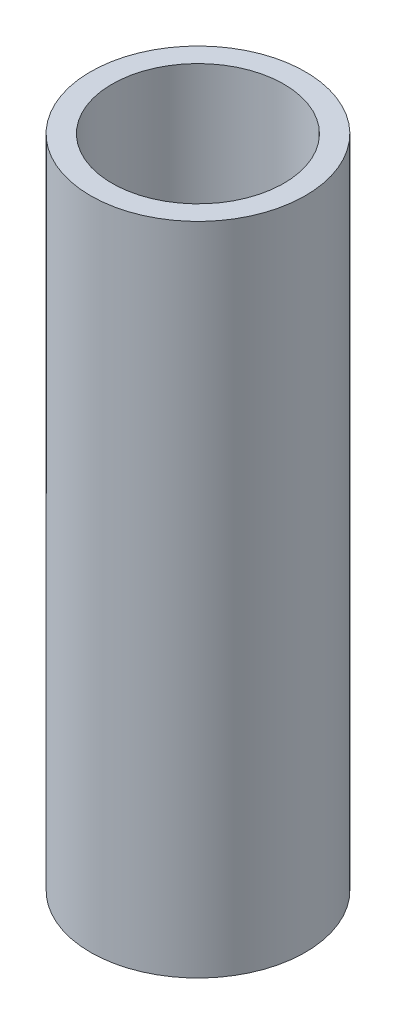
ISO-10303-21;
HEADER;
FILE_DESCRIPTION(('STEP AP214'),'2;1');
FILE_NAME('part.step','',(''),(''),'','','');
FILE_SCHEMA(('AUTOMOTIVE_DESIGN { 1 0 10303 214 1 1 1 1 }'));
ENDSEC;
DATA;
#1=APPLICATION_CONTEXT('core data for automotive mechanical design processes');
#2=APPLICATION_PROTOCOL_DEFINITION('international standard','automotive_design',2000,#1);
#3=PRODUCT_CONTEXT('',#1,'mechanical');
#4=PRODUCT('Part','Part','',(#3));
#5=PRODUCT_RELATED_PRODUCT_CATEGORY('part','',(#4));
#6=PRODUCT_DEFINITION_FORMATION('','',#4);
#7=PRODUCT_DEFINITION_CONTEXT('part definition',#1,'design');
#8=PRODUCT_DEFINITION('design','',#6,#7);
#9=PRODUCT_DEFINITION_SHAPE('','',#8);
#10=(LENGTH_UNIT() NAMED_UNIT(*) SI_UNIT(.MILLI.,.METRE.));
#11=(NAMED_UNIT(*) PLANE_ANGLE_UNIT() SI_UNIT($,.RADIAN.));
#12=(NAMED_UNIT(*) SI_UNIT($,.STERADIAN.) SOLID_ANGLE_UNIT());
#13=UNCERTAINTY_MEASURE_WITH_UNIT(LENGTH_MEASURE(1.E-05),#10,'distance_accuracy_value','');
#14=(GEOMETRIC_REPRESENTATION_CONTEXT(3) GLOBAL_UNCERTAINTY_ASSIGNED_CONTEXT((#13)) GLOBAL_UNIT_ASSIGNED_CONTEXT((#10,
#11,#12)) REPRESENTATION_CONTEXT('',''));
#15=CARTESIAN_POINT('',(0.,0.,0.));
#16=DIRECTION('',(0.,0.,1.));
#17=DIRECTION('',(1.,0.,0.));
#18=AXIS2_PLACEMENT_3D('',#15,#16,#17);
#19=CARTESIAN_POINT('',(0.,3.,0.));
#20=DIRECTION('',(0.,1.,0.));
#21=DIRECTION('',(0.,0.,1.));
#22=AXIS2_PLACEMENT_3D('',#19,#20,#21);
#23=PLANE('',#22);
#24=CARTESIAN_POINT('',(0.,3.,0.));
#25=DIRECTION('',(0.,1.,0.));
#26=DIRECTION('',(0.,0.,1.));
#27=AXIS2_PLACEMENT_3D('',#24,#25,#26);
#28=CIRCLE('',#27,2.65);
#29=CARTESIAN_POINT('',(0.,3.,2.65));
#30=VERTEX_POINT('',#29);
#31=EDGE_CURVE('E50',#30,#30,#28,.T.);
#32=ORIENTED_EDGE('',*,*,#31,.F.);
#33=EDGE_LOOP('',(#32));
#34=FACE_BOUND('',#33,.T.);
#35=CARTESIAN_POINT('',(0.,3.,0.));
#36=DIRECTION('',(0.,1.,0.));
#37=DIRECTION('',(0.,0.,1.));
#38=AXIS2_PLACEMENT_3D('',#35,#36,#37);
#39=CIRCLE('',#38,8.);
#40=CARTESIAN_POINT('',(0.,3.,-8.));
#41=VERTEX_POINT('',#40);
#42=EDGE_CURVE('E10',#41,#41,#39,.F.);
#43=ORIENTED_EDGE('',*,*,#42,.F.);
#44=EDGE_LOOP('',(#43));
#45=FACE_BOUND('',#44,.T.);
#46=ADVANCED_FACE('F37',(#34,#45),#23,.T.);
#47=CARTESIAN_POINT('',(0.,0.,0.));
#48=DIRECTION('',(0.,1.,0.));
#49=DIRECTION('',(0.,0.,1.));
#50=AXIS2_PLACEMENT_3D('',#47,#48,#49);
#51=PLANE('',#50);
#52=CARTESIAN_POINT('',(0.,0.,0.));
#53=DIRECTION('',(0.,1.,0.));
#54=DIRECTION('',(0.,0.,1.));
#55=AXIS2_PLACEMENT_3D('',#52,#53,#54);
#56=CIRCLE('',#55,10.);
#57=CARTESIAN_POINT('',(0.,0.,10.));
#58=VERTEX_POINT('',#57);
#59=EDGE_CURVE('E45',#58,#58,#56,.T.);
#60=ORIENTED_EDGE('',*,*,#59,.F.);
#61=EDGE_LOOP('',(#60));
#62=FACE_BOUND('',#61,.T.);
#63=CARTESIAN_POINT('',(0.,0.,0.));
#64=DIRECTION('',(0.,1.,0.));
#65=DIRECTION('',(0.,0.,1.));
#66=AXIS2_PLACEMENT_3D('',#63,#64,#65);
#67=CIRCLE('',#66,2.65);
#68=CARTESIAN_POINT('',(0.,0.,2.65));
#69=VERTEX_POINT('',#68);
#70=EDGE_CURVE('E55',#69,#69,#67,.T.);
#71=ORIENTED_EDGE('',*,*,#70,.T.);
#72=EDGE_LOOP('',(#71));
#73=FACE_BOUND('',#72,.T.);
#74=ADVANCED_FACE('F85',(#62,#73),#51,.F.);
#75=CARTESIAN_POINT('',(0.,3.,0.));
#76=DIRECTION('',(0.,-1.,0.));
#77=DIRECTION('',(0.,0.,-1.));
#78=AXIS2_PLACEMENT_3D('',#75,#76,#77);
#79=CYLINDRICAL_SURFACE('',#78,10.);
#80=ORIENTED_EDGE('',*,*,#59,.T.);
#81=EDGE_LOOP('',(#80));
#82=FACE_BOUND('',#81,.T.);
#83=CARTESIAN_POINT('',(0.,61.,0.));
#84=DIRECTION('',(0.,1.,0.));
#85=DIRECTION('',(0.,0.,1.));
#86=AXIS2_PLACEMENT_3D('',#83,#84,#85);
#87=CIRCLE('',#86,10.);
#88=CARTESIAN_POINT('',(0.,61.,10.));
#89=VERTEX_POINT('',#88);
#90=EDGE_CURVE('E60',#89,#89,#87,.T.);
#91=ORIENTED_EDGE('',*,*,#90,.F.);
#92=EDGE_LOOP('',(#91));
#93=FACE_BOUND('',#92,.T.);
#94=ADVANCED_FACE('F39',(#82,#93),#79,.T.);
#95=CARTESIAN_POINT('',(0.,3.,0.));
#96=DIRECTION('',(0.,-1.,0.));
#97=DIRECTION('',(0.,0.,-1.));
#98=AXIS2_PLACEMENT_3D('',#95,#96,#97);
#99=CYLINDRICAL_SURFACE('',#98,2.65);
#100=ORIENTED_EDGE('',*,*,#31,.T.);
#101=EDGE_LOOP('',(#100));
#102=FACE_BOUND('',#101,.T.);
#103=ORIENTED_EDGE('',*,*,#70,.F.);
#104=EDGE_LOOP('',(#103));
#105=FACE_BOUND('',#104,.T.);
#106=ADVANCED_FACE('F74',(#102,#105),#99,.F.);
#107=CARTESIAN_POINT('',(0.,61.,0.));
#108=DIRECTION('',(0.,1.,0.));
#109=DIRECTION('',(0.,0.,1.));
#110=AXIS2_PLACEMENT_3D('',#107,#108,#109);
#111=PLANE('',#110);
#112=ORIENTED_EDGE('',*,*,#90,.T.);
#113=EDGE_LOOP('',(#112));
#114=FACE_BOUND('',#113,.T.);
#115=CARTESIAN_POINT('',(0.,61.,0.));
#116=DIRECTION('',(0.,1.,0.));
#117=DIRECTION('',(0.,0.,1.));
#118=AXIS2_PLACEMENT_3D('',#115,#116,#117);
#119=CIRCLE('',#118,8.);
#120=CARTESIAN_POINT('',(0.,61.,-8.));
#121=VERTEX_POINT('',#120);
#122=EDGE_CURVE('E65',#121,#121,#119,.T.);
#123=ORIENTED_EDGE('',*,*,#122,.F.);
#124=EDGE_LOOP('',(#123));
#125=FACE_BOUND('',#124,.T.);
#126=ADVANCED_FACE('F72',(#114,#125),#111,.T.);
#127=CARTESIAN_POINT('',(0.,61.,0.));
#128=DIRECTION('',(0.,-1.,0.));
#129=DIRECTION('',(0.,0.,-1.));
#130=AXIS2_PLACEMENT_3D('',#127,#128,#129);
#131=CYLINDRICAL_SURFACE('',#130,8.);
#132=CARTESIAN_POINT('',(0.,61.,-8.));
#133=CARTESIAN_POINT('',(0.,60.3958333333333,-8.));
#134=CARTESIAN_POINT('',(0.,59.7916666666667,-8.));
#135=CARTESIAN_POINT('',(0.,58.5833333333333,-8.));
#136=CARTESIAN_POINT('',(0.,57.9791666666667,-8.));
#137=CARTESIAN_POINT('',(0.,56.7708333333333,-8.));
#138=CARTESIAN_POINT('',(0.,56.1666666666667,-8.));
#139=CARTESIAN_POINT('',(0.,54.9583333333333,-8.));
#140=CARTESIAN_POINT('',(0.,54.3541666666667,-8.));
#141=CARTESIAN_POINT('',(0.,53.1458333333333,-8.));
#142=CARTESIAN_POINT('',(0.,52.5416666666667,-8.));
#143=CARTESIAN_POINT('',(0.,51.3333333333333,-8.));
#144=CARTESIAN_POINT('',(0.,50.7291666666667,-8.));
#145=CARTESIAN_POINT('',(0.,49.5208333333333,-8.));
#146=CARTESIAN_POINT('',(0.,48.9166666666667,-8.));
#147=CARTESIAN_POINT('',(0.,47.7083333333333,-8.));
#148=CARTESIAN_POINT('',(0.,47.1041666666667,-8.));
#149=CARTESIAN_POINT('',(0.,45.8958333333333,-8.));
#150=CARTESIAN_POINT('',(0.,45.2916666666667,-8.));
#151=CARTESIAN_POINT('',(0.,44.0833333333333,-8.));
#152=CARTESIAN_POINT('',(0.,43.4791666666667,-8.));
#153=CARTESIAN_POINT('',(0.,42.2708333333333,-8.));
#154=CARTESIAN_POINT('',(0.,41.6666666666667,-8.));
#155=CARTESIAN_POINT('',(0.,40.4583333333333,-8.));
#156=CARTESIAN_POINT('',(0.,39.8541666666667,-8.));
#157=CARTESIAN_POINT('',(0.,38.6458333333333,-8.));
#158=CARTESIAN_POINT('',(0.,38.0416666666667,-8.));
#159=CARTESIAN_POINT('',(0.,36.8333333333333,-8.));
#160=CARTESIAN_POINT('',(0.,36.2291666666667,-8.));
#161=CARTESIAN_POINT('',(0.,35.0208333333333,-8.));
#162=CARTESIAN_POINT('',(0.,34.4166666666667,-8.));
#163=CARTESIAN_POINT('',(0.,33.2083333333333,-8.));
#164=CARTESIAN_POINT('',(0.,32.6041666666667,-8.));
#165=CARTESIAN_POINT('',(0.,31.3958333333333,-8.));
#166=CARTESIAN_POINT('',(0.,30.7916666666667,-8.));
#167=CARTESIAN_POINT('',(0.,29.5833333333333,-8.));
#168=CARTESIAN_POINT('',(0.,28.9791666666667,-8.));
#169=CARTESIAN_POINT('',(0.,27.7708333333333,-8.));
#170=CARTESIAN_POINT('',(0.,27.1666666666667,-8.));
#171=CARTESIAN_POINT('',(0.,25.9583333333333,-8.));
#172=CARTESIAN_POINT('',(0.,25.3541666666667,-8.));
#173=CARTESIAN_POINT('',(0.,24.1458333333333,-8.));
#174=CARTESIAN_POINT('',(0.,23.5416666666667,-8.));
#175=CARTESIAN_POINT('',(0.,22.3333333333333,-8.));
#176=CARTESIAN_POINT('',(0.,21.7291666666667,-8.));
#177=CARTESIAN_POINT('',(0.,20.5208333333333,-8.));
#178=CARTESIAN_POINT('',(0.,19.9166666666667,-8.));
#179=CARTESIAN_POINT('',(0.,18.7083333333333,-8.));
#180=CARTESIAN_POINT('',(0.,18.1041666666667,-8.));
#181=CARTESIAN_POINT('',(0.,16.8958333333333,-8.));
#182=CARTESIAN_POINT('',(0.,16.2916666666667,-8.));
#183=CARTESIAN_POINT('',(0.,15.0833333333333,-8.));
#184=CARTESIAN_POINT('',(0.,14.4791666666667,-8.));
#185=CARTESIAN_POINT('',(0.,13.2708333333333,-8.));
#186=CARTESIAN_POINT('',(0.,12.6666666666667,-8.));
#187=CARTESIAN_POINT('',(0.,11.4583333333333,-8.));
#188=CARTESIAN_POINT('',(0.,10.8541666666667,-8.));
#189=CARTESIAN_POINT('',(0.,9.64583333333333,-8.));
#190=CARTESIAN_POINT('',(0.,9.04166666666667,-8.));
#191=CARTESIAN_POINT('',(0.,7.83333333333334,-8.));
#192=CARTESIAN_POINT('',(0.,7.22916666666667,-8.));
#193=CARTESIAN_POINT('',(0.,6.02083333333334,-8.));
#194=CARTESIAN_POINT('',(0.,5.41666666666667,-8.));
#195=CARTESIAN_POINT('',(0.,4.20833333333334,-8.));
#196=CARTESIAN_POINT('',(0.,3.60416666666667,-8.));
#197=CARTESIAN_POINT('',(0.,3.,-8.));
#198=B_SPLINE_CURVE_WITH_KNOTS('',3,(#132,#133,#134,#135,#136,#137,#138,#139,#140,#141,#142,
#143,#144,#145,#146,#147,#148,#149,#150,#151,#152,#153,#154,#155,#156,#157,#158,#159,#160,#161,
#162,#163,#164,#165,#166,#167,#168,#169,#170,#171,#172,#173,#174,#175,#176,#177,#178,#179,#180,
#181,#182,#183,#184,#185,#186,#187,#188,#189,#190,#191,#192,#193,#194,#195,#196,#197),
.UNSPECIFIED.,.F.,.F.,(4,2,2,2,2,2,2,2,2,2,2,2,2,2,2,2,2,2,2,2,2,2,2,2,2,2,2,2,2,2,2,2,4),(0.,
1.81249999999999,3.625,5.4375,7.24999999999999,9.06249999999999,10.875,12.6875,14.5,16.3125,
18.125,19.9375,21.75,23.5625,25.375,27.1875,29.,30.8125,32.625,34.4375,36.25,38.0625,39.875,
41.6875,43.5,45.3125,47.125,48.9375,50.75,52.5625,54.375,56.1875,58.),.UNSPECIFIED.);
#199=EDGE_CURVE('BSEAM70',#121,#41,#198,.T.);
#200=ORIENTED_EDGE('',*,*,#122,.T.);
#201=ORIENTED_EDGE('',*,*,#42,.T.);
#202=ORIENTED_EDGE('',*,*,#199,.T.);
#203=ORIENTED_EDGE('',*,*,#199,.F.);
#204=EDGE_LOOP('',(#200,#202,#201,#203));
#205=FACE_BOUND('',#204,.T.);
#206=ADVANCED_FACE('F70',(#205),#131,.F.);
#207=CLOSED_SHELL('',(#46,#74,#94,#106,#126,#206));
#208=MANIFOLD_SOLID_BREP('B2',#207);
#209=ADVANCED_BREP_SHAPE_REPRESENTATION('',(#18,#208),#14);
#210=SHAPE_DEFINITION_REPRESENTATION(#9,#209);
ENDSEC;
END-ISO-10303-21;
